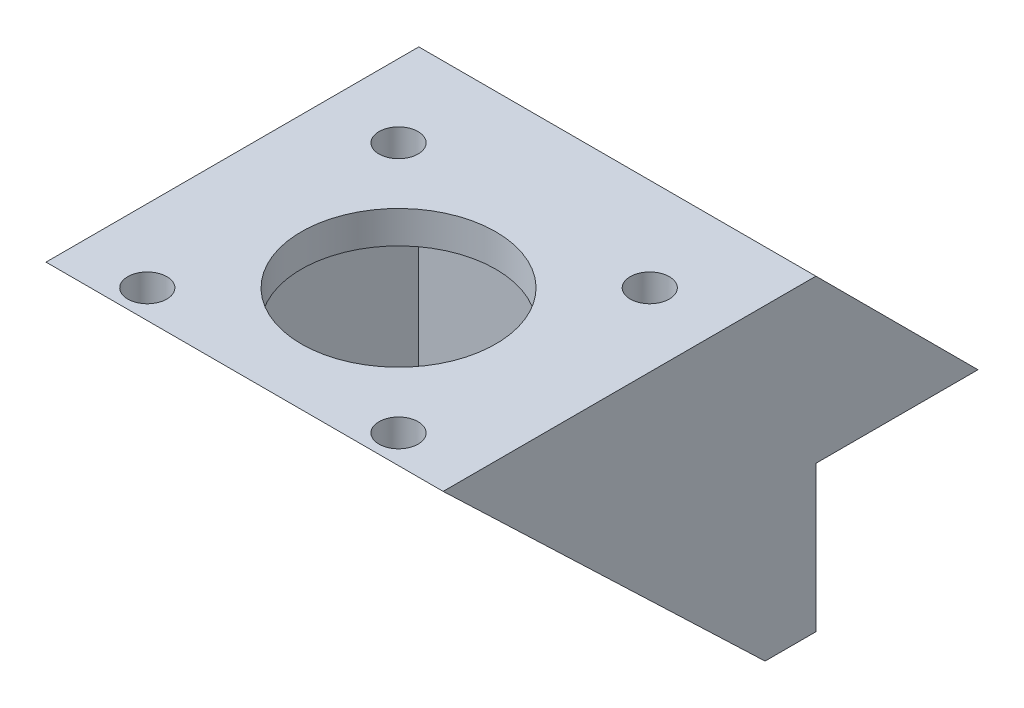
ISO-10303-21;
HEADER;
FILE_DESCRIPTION(('STEP AP214'),'2;1');
FILE_NAME('part.step','',(''),(''),'','','');
FILE_SCHEMA(('AUTOMOTIVE_DESIGN { 1 0 10303 214 1 1 1 1 }'));
ENDSEC;
DATA;
#1=APPLICATION_CONTEXT('core data for automotive mechanical design processes');
#2=APPLICATION_PROTOCOL_DEFINITION('international standard','automotive_design',2000,#1);
#3=PRODUCT_CONTEXT('',#1,'mechanical');
#4=PRODUCT('Part','Part','',(#3));
#5=PRODUCT_RELATED_PRODUCT_CATEGORY('part','',(#4));
#6=PRODUCT_DEFINITION_FORMATION('','',#4);
#7=PRODUCT_DEFINITION_CONTEXT('part definition',#1,'design');
#8=PRODUCT_DEFINITION('design','',#6,#7);
#9=PRODUCT_DEFINITION_SHAPE('','',#8);
#10=(LENGTH_UNIT() NAMED_UNIT(*) SI_UNIT(.MILLI.,.METRE.));
#11=(NAMED_UNIT(*) PLANE_ANGLE_UNIT() SI_UNIT($,.RADIAN.));
#12=(NAMED_UNIT(*) SI_UNIT($,.STERADIAN.) SOLID_ANGLE_UNIT());
#13=UNCERTAINTY_MEASURE_WITH_UNIT(LENGTH_MEASURE(1.E-05),#10,'distance_accuracy_value','');
#14=(GEOMETRIC_REPRESENTATION_CONTEXT(3) GLOBAL_UNCERTAINTY_ASSIGNED_CONTEXT((#13)) GLOBAL_UNIT_ASSIGNED_CONTEXT((#10,
#11,#12)) REPRESENTATION_CONTEXT('',''));
#15=CARTESIAN_POINT('',(0.,0.,0.));
#16=DIRECTION('',(0.,0.,1.));
#17=DIRECTION('',(1.,0.,0.));
#18=AXIS2_PLACEMENT_3D('',#15,#16,#17);
#19=CARTESIAN_POINT('',(10.5,-6.00000000000001,-23.));
#20=DIRECTION('',(0.,1.,0.));
#21=DIRECTION('',(0.,0.,1.));
#22=AXIS2_PLACEMENT_3D('',#19,#20,#21);
#23=CYLINDRICAL_SURFACE('',#22,4.25);
#24=CARTESIAN_POINT('',(10.5,24.,-23.));
#25=DIRECTION('',(0.,-1.,0.));
#26=DIRECTION('',(0.,0.,-1.));
#27=AXIS2_PLACEMENT_3D('',#24,#25,#26);
#28=CIRCLE('',#27,4.25);
#29=CARTESIAN_POINT('',(10.5,24.,-27.25));
#30=VERTEX_POINT('',#29);
#31=EDGE_CURVE('E216',#30,#30,#28,.T.);
#32=ORIENTED_EDGE('',*,*,#31,.T.);
#33=EDGE_LOOP('',(#32));
#34=FACE_BOUND('',#33,.T.);
#35=CARTESIAN_POINT('',(10.5,26.,-23.));
#36=DIRECTION('',(0.,1.,0.));
#37=DIRECTION('',(0.,0.,1.));
#38=AXIS2_PLACEMENT_3D('',#35,#36,#37);
#39=CIRCLE('',#38,4.25);
#40=CARTESIAN_POINT('',(10.5,26.,-18.75));
#41=VERTEX_POINT('',#40);
#42=EDGE_CURVE('E221',#41,#41,#39,.F.);
#43=ORIENTED_EDGE('',*,*,#42,.F.);
#44=EDGE_LOOP('',(#43));
#45=FACE_BOUND('',#44,.T.);
#46=ADVANCED_FACE('F54',(#34,#45),#23,.F.);
#47=CARTESIAN_POINT('',(-20.5110476695631,40.,-9.));
#48=DIRECTION('',(0.,-1.,0.));
#49=DIRECTION('',(0.,0.,-1.));
#50=AXIS2_PLACEMENT_3D('',#47,#48,#49);
#51=PLANE('',#50);
#52=CARTESIAN_POINT('',(0.,40.,14.));
#53=DIRECTION('',(0.,-1.,0.));
#54=DIRECTION('',(0.,0.,-1.));
#55=AXIS2_PLACEMENT_3D('',#52,#53,#54);
#56=CIRCLE('',#55,12.);
#57=CARTESIAN_POINT('',(0.,40.,1.99999999999999));
#58=VERTEX_POINT('',#57);
#59=EDGE_CURVE('E262',#58,#58,#56,.T.);
#60=ORIENTED_EDGE('',*,*,#59,.F.);
#61=EDGE_LOOP('',(#60));
#62=FACE_BOUND('',#61,.T.);
#63=CARTESIAN_POINT('',(15.5,40.,-1.50000000000001));
#64=DIRECTION('',(0.,-1.,0.));
#65=DIRECTION('',(0.,0.,-1.));
#66=AXIS2_PLACEMENT_3D('',#63,#64,#65);
#67=CIRCLE('',#66,2.40826824338042);
#68=CARTESIAN_POINT('',(15.5,40.,-3.90826824338043));
#69=VERTEX_POINT('',#68);
#70=EDGE_CURVE('E220',#69,#69,#67,.T.);
#71=ORIENTED_EDGE('',*,*,#70,.F.);
#72=EDGE_LOOP('',(#71));
#73=FACE_BOUND('',#72,.T.);
#74=CARTESIAN_POINT('',(-15.5,40.,-1.5));
#75=DIRECTION('',(0.,-1.,0.));
#76=DIRECTION('',(0.,0.,-1.));
#77=AXIS2_PLACEMENT_3D('',#74,#75,#76);
#78=CIRCLE('',#77,2.40826824338042);
#79=CARTESIAN_POINT('',(-15.5,40.,-3.90826824338042));
#80=VERTEX_POINT('',#79);
#81=EDGE_CURVE('E254',#80,#80,#78,.F.);
#82=ORIENTED_EDGE('',*,*,#81,.T.);
#83=EDGE_LOOP('',(#82));
#84=FACE_BOUND('',#83,.T.);
#85=DIRECTION('',(1.,0.,0.));
#86=VECTOR('',#85,1.);
#87=CARTESIAN_POINT('',(-20.5110476695631,40.,28.8181818181818));
#88=LINE('',#87,#86);
#89=CARTESIAN_POINT('',(17.8097358937802,40.,28.8181818181818));
#90=VERTEX_POINT('',#89);
#91=CARTESIAN_POINT('',(21.4889523304369,40.,28.8181818181818));
#92=VERTEX_POINT('',#91);
#93=EDGE_CURVE('E183',#90,#92,#88,.T.);
#94=ORIENTED_EDGE('',*,*,#93,.F.);
#95=CARTESIAN_POINT('',(15.5,40.,29.5));
#96=DIRECTION('',(0.,-1.,0.));
#97=DIRECTION('',(0.,0.,-1.));
#98=AXIS2_PLACEMENT_3D('',#95,#96,#97);
#99=CIRCLE('',#98,2.40826824338042);
#100=CARTESIAN_POINT('',(13.1902641062198,40.,28.8181818181818));
#101=VERTEX_POINT('',#100);
#102=EDGE_CURVE('E78',#90,#101,#99,.F.);
#103=ORIENTED_EDGE('',*,*,#102,.T.);
#104=CARTESIAN_POINT('',(-13.1902641062198,40.,28.8181818181818));
#105=VERTEX_POINT('',#104);
#106=EDGE_CURVE('E187',#105,#101,#88,.T.);
#107=ORIENTED_EDGE('',*,*,#106,.F.);
#108=CARTESIAN_POINT('',(-15.5,40.,29.5));
#109=DIRECTION('',(0.,-1.,0.));
#110=DIRECTION('',(0.,0.,-1.));
#111=AXIS2_PLACEMENT_3D('',#108,#109,#110);
#112=CIRCLE('',#111,2.40826824338042);
#113=CARTESIAN_POINT('',(-17.8097358937802,40.,28.8181818181818));
#114=VERTEX_POINT('',#113);
#115=EDGE_CURVE('E260',#114,#105,#112,.T.);
#116=ORIENTED_EDGE('',*,*,#115,.F.);
#117=CARTESIAN_POINT('',(-20.5110476695631,40.,28.8181818181818));
#118=VERTEX_POINT('',#117);
#119=EDGE_CURVE('E184',#118,#114,#88,.T.);
#120=ORIENTED_EDGE('',*,*,#119,.F.);
#121=DIRECTION('',(0.,0.,1.));
#122=VECTOR('',#121,1.);
#123=CARTESIAN_POINT('',(-20.5110476695631,40.,-9.));
#124=LINE('',#123,#122);
#125=CARTESIAN_POINT('',(-20.5110476695631,40.,-9.));
#126=VERTEX_POINT('',#125);
#127=EDGE_CURVE('E199',#126,#118,#124,.T.);
#128=ORIENTED_EDGE('',*,*,#127,.F.);
#129=DIRECTION('',(1.,0.,0.));
#130=VECTOR('',#129,1.);
#131=CARTESIAN_POINT('',(-20.5110476695631,40.,-9.));
#132=LINE('',#131,#130);
#133=CARTESIAN_POINT('',(21.4889523304369,40.,-9.));
#134=VERTEX_POINT('',#133);
#135=EDGE_CURVE('E192',#126,#134,#132,.T.);
#136=ORIENTED_EDGE('',*,*,#135,.T.);
#137=DIRECTION('',(0.,0.,1.));
#138=VECTOR('',#137,1.);
#139=CARTESIAN_POINT('',(21.4889523304369,40.,-9.));
#140=LINE('',#139,#138);
#141=EDGE_CURVE('E202',#134,#92,#140,.T.);
#142=ORIENTED_EDGE('',*,*,#141,.T.);
#143=EDGE_LOOP('',(#94,#103,#107,#116,#120,#128,#136,#142));
#144=FACE_BOUND('',#143,.T.);
#145=ADVANCED_FACE('F313',(#62,#73,#84,#144),#51,.T.);
#146=CARTESIAN_POINT('',(25.5,6.49358341559724,-6.21125370187562));
#147=DIRECTION('',(0.,0.722641857147699,-0.691222645967364));
#148=DIRECTION('',(0.,0.691222645967364,0.722641857147699));
#149=AXIS2_PLACEMENT_3D('',#146,#147,#148);
#150=PLANE('',#149);
#151=DIRECTION('',(0.,-0.691222645967364,-0.722641857147699));
#152=VECTOR('',#151,1.);
#153=CARTESIAN_POINT('',(-24.5,6.49358341559724,-6.21125370187562));
#154=LINE('',#153,#152);
#155=CARTESIAN_POINT('',(-24.5,44.,33.));
#156=VERTEX_POINT('',#155);
#157=CARTESIAN_POINT('',(-24.5,6.,-6.72727272727273));
#158=VERTEX_POINT('',#157);
#159=EDGE_CURVE('E165',#156,#158,#154,.T.);
#160=ORIENTED_EDGE('',*,*,#159,.T.);
#161=DIRECTION('',(1.,0.,0.));
#162=VECTOR('',#161,1.);
#163=CARTESIAN_POINT('',(25.5,6.,-6.72727272727273));
#164=LINE('',#163,#162);
#165=CARTESIAN_POINT('',(-20.5110476695631,6.,-6.72727272727273));
#166=VERTEX_POINT('',#165);
#167=EDGE_CURVE('E296',#158,#166,#164,.T.);
#168=ORIENTED_EDGE('',*,*,#167,.T.);
#169=DIRECTION('',(0.,0.691222645967364,0.722641857147699));
#170=VECTOR('',#169,1.);
#171=CARTESIAN_POINT('',(-20.5110476695631,1.99802566633761,-10.9111549851925));
#172=LINE('',#171,#170);
#173=EDGE_CURVE('E179',#166,#118,#172,.T.);
#174=ORIENTED_EDGE('',*,*,#173,.T.);
#175=ORIENTED_EDGE('',*,*,#119,.T.);
#176=CARTESIAN_POINT('',(-15.5,40.6521739130435,29.5));
#177=DIRECTION('',(0.,0.722641857147699,-0.691222645967364));
#178=DIRECTION('',(0.,0.691222645967364,0.722641857147699));
#179=AXIS2_PLACEMENT_3D('',#176,#177,#178);
#180=ELLIPSE('',#179,3.33258891601708,2.40826824338042);
#181=EDGE_CURVE('E257',#114,#105,#180,.T.);
#182=ORIENTED_EDGE('',*,*,#181,.T.);
#183=ORIENTED_EDGE('',*,*,#106,.T.);
#184=CARTESIAN_POINT('',(15.5,40.6521739130435,29.5));
#185=DIRECTION('',(0.,0.722641857147699,-0.691222645967364));
#186=DIRECTION('',(0.,0.691222645967364,0.722641857147699));
#187=AXIS2_PLACEMENT_3D('',#184,#185,#186);
#188=ELLIPSE('',#187,3.33258891601708,2.40826824338042);
#189=EDGE_CURVE('E265',#90,#101,#188,.F.);
#190=ORIENTED_EDGE('',*,*,#189,.F.);
#191=ORIENTED_EDGE('',*,*,#93,.T.);
#192=DIRECTION('',(0.,0.691222645967364,0.722641857147699));
#193=VECTOR('',#192,1.);
#194=CARTESIAN_POINT('',(21.4889523304369,1.99802566633761,-10.9111549851925));
#195=LINE('',#194,#193);
#196=CARTESIAN_POINT('',(21.4889523304369,6.,-6.72727272727273));
#197=VERTEX_POINT('',#196);
#198=EDGE_CURVE('E181',#197,#92,#195,.T.);
#199=ORIENTED_EDGE('',*,*,#198,.F.);
#200=CARTESIAN_POINT('',(24.5,6.,-6.72727272727273));
#201=VERTEX_POINT('',#200);
#202=EDGE_CURVE('E293',#197,#201,#164,.T.);
#203=ORIENTED_EDGE('',*,*,#202,.T.);
#204=DIRECTION('',(0.,-0.691222645967364,-0.722641857147699));
#205=VECTOR('',#204,1.);
#206=CARTESIAN_POINT('',(24.5,44.,33.));
#207=LINE('',#206,#205);
#208=CARTESIAN_POINT('',(24.5,44.,33.));
#209=VERTEX_POINT('',#208);
#210=EDGE_CURVE('E159',#209,#201,#207,.T.);
#211=ORIENTED_EDGE('',*,*,#210,.F.);
#212=DIRECTION('',(1.,0.,0.));
#213=VECTOR('',#212,1.);
#214=CARTESIAN_POINT('',(24.5,44.,33.));
#215=LINE('',#214,#213);
#216=EDGE_CURVE('E208',#156,#209,#215,.T.);
#217=ORIENTED_EDGE('',*,*,#216,.F.);
#218=EDGE_LOOP('',(#160,#168,#174,#175,#182,#183,#190,#191,#199,#203,#211,#217));
#219=FACE_BOUND('',#218,.T.);
#220=ADVANCED_FACE('F285',(#219),#150,.F.);
#221=CARTESIAN_POINT('',(0.,44.,0.));
#222=DIRECTION('',(0.,1.,0.));
#223=DIRECTION('',(0.,0.,1.));
#224=AXIS2_PLACEMENT_3D('',#221,#222,#223);
#225=PLANE('',#224);
#226=CARTESIAN_POINT('',(-15.5,44.,-1.5));
#227=DIRECTION('',(0.,-1.,0.));
#228=DIRECTION('',(0.,0.,-1.));
#229=AXIS2_PLACEMENT_3D('',#226,#227,#228);
#230=CIRCLE('',#229,2.40826824338042);
#231=CARTESIAN_POINT('',(-15.5,44.,-3.90826824338042));
#232=VERTEX_POINT('',#231);
#233=EDGE_CURVE('E232',#232,#232,#230,.T.);
#234=ORIENTED_EDGE('',*,*,#233,.T.);
#235=EDGE_LOOP('',(#234));
#236=FACE_BOUND('',#235,.T.);
#237=CARTESIAN_POINT('',(15.5,44.,-1.50000000000001));
#238=DIRECTION('',(0.,1.,0.));
#239=DIRECTION('',(0.,0.,1.));
#240=AXIS2_PLACEMENT_3D('',#237,#238,#239);
#241=CIRCLE('',#240,2.40826824338042);
#242=CARTESIAN_POINT('',(15.5,44.,0.908268243380413));
#243=VERTEX_POINT('',#242);
#244=EDGE_CURVE('E217',#243,#243,#241,.T.);
#245=ORIENTED_EDGE('',*,*,#244,.F.);
#246=EDGE_LOOP('',(#245));
#247=FACE_BOUND('',#246,.T.);
#248=DIRECTION('',(0.,0.,-1.));
#249=VECTOR('',#248,1.);
#250=CARTESIAN_POINT('',(24.5,44.,33.));
#251=LINE('',#250,#249);
#252=CARTESIAN_POINT('',(24.5,44.,-13.));
#253=VERTEX_POINT('',#252);
#254=EDGE_CURVE('E63',#209,#253,#251,.T.);
#255=ORIENTED_EDGE('',*,*,#254,.T.);
#256=DIRECTION('',(-1.,0.,0.));
#257=VECTOR('',#256,1.);
#258=CARTESIAN_POINT('',(0.,44.,-13.));
#259=LINE('',#258,#257);
#260=CARTESIAN_POINT('',(-24.5,44.,-13.));
#261=VERTEX_POINT('',#260);
#262=EDGE_CURVE('E12',#253,#261,#259,.T.);
#263=ORIENTED_EDGE('',*,*,#262,.T.);
#264=DIRECTION('',(0.,0.,1.));
#265=VECTOR('',#264,1.);
#266=CARTESIAN_POINT('',(-24.5,44.,33.));
#267=LINE('',#266,#265);
#268=EDGE_CURVE('E205',#261,#156,#267,.T.);
#269=ORIENTED_EDGE('',*,*,#268,.T.);
#270=ORIENTED_EDGE('',*,*,#216,.T.);
#271=EDGE_LOOP('',(#255,#263,#269,#270));
#272=FACE_BOUND('',#271,.T.);
#273=CARTESIAN_POINT('',(-15.5,44.,29.5));
#274=DIRECTION('',(0.,1.,0.));
#275=DIRECTION('',(0.,0.,1.));
#276=AXIS2_PLACEMENT_3D('',#273,#274,#275);
#277=CIRCLE('',#276,2.40826824338042);
#278=CARTESIAN_POINT('',(-15.5,44.,31.9082682433804));
#279=VERTEX_POINT('',#278);
#280=EDGE_CURVE('E236',#279,#279,#277,.T.);
#281=ORIENTED_EDGE('',*,*,#280,.F.);
#282=EDGE_LOOP('',(#281));
#283=FACE_BOUND('',#282,.T.);
#284=CARTESIAN_POINT('',(0.,44.,14.));
#285=DIRECTION('',(0.,1.,0.));
#286=DIRECTION('',(0.,0.,1.));
#287=AXIS2_PLACEMENT_3D('',#284,#285,#286);
#288=CIRCLE('',#287,12.);
#289=CARTESIAN_POINT('',(0.,44.,26.));
#290=VERTEX_POINT('',#289);
#291=EDGE_CURVE('E247',#290,#290,#288,.T.);
#292=ORIENTED_EDGE('',*,*,#291,.F.);
#293=EDGE_LOOP('',(#292));
#294=FACE_BOUND('',#293,.T.);
#295=CARTESIAN_POINT('',(15.5,44.,29.5));
#296=DIRECTION('',(0.,-1.,0.));
#297=DIRECTION('',(0.,0.,-1.));
#298=AXIS2_PLACEMENT_3D('',#295,#296,#297);
#299=CIRCLE('',#298,2.40826824338042);
#300=CARTESIAN_POINT('',(15.5,44.,27.0917317566196));
#301=VERTEX_POINT('',#300);
#302=EDGE_CURVE('E241',#301,#301,#299,.T.);
#303=ORIENTED_EDGE('',*,*,#302,.T.);
#304=EDGE_LOOP('',(#303));
#305=FACE_BOUND('',#304,.T.);
#306=ADVANCED_FACE('F282',(#236,#247,#272,#283,#294,#305),#225,.T.);
#307=CARTESIAN_POINT('',(25.5,28.5,-28.5));
#308=DIRECTION('',(0.,0.707106781186548,-0.707106781186548));
#309=DIRECTION('',(0.,0.707106781186548,0.707106781186548));
#310=AXIS2_PLACEMENT_3D('',#307,#308,#309);
#311=PLANE('',#310);
#312=CARTESIAN_POINT('',(10.5,34.,-23.));
#313=DIRECTION('',(0.,0.707106781186548,-0.707106781186548));
#314=DIRECTION('',(0.,0.707106781186548,0.707106781186548));
#315=AXIS2_PLACEMENT_3D('',#312,#313,#314);
#316=ELLIPSE('',#315,7.07106781186548,5.);
#317=CARTESIAN_POINT('',(10.5,39.,-18.));
#318=VERTEX_POINT('',#317);
#319=EDGE_CURVE('E58',#318,#318,#316,.T.);
#320=ORIENTED_EDGE('',*,*,#319,.F.);
#321=EDGE_LOOP('',(#320));
#322=FACE_BOUND('',#321,.T.);
#323=CARTESIAN_POINT('',(-10.5,34.,-23.));
#324=DIRECTION('',(0.,0.707106781186548,-0.707106781186548));
#325=DIRECTION('',(0.,0.707106781186548,0.707106781186548));
#326=AXIS2_PLACEMENT_3D('',#323,#324,#325);
#327=ELLIPSE('',#326,7.07106781186548,5.);
#328=CARTESIAN_POINT('',(-10.5,39.,-18.));
#329=VERTEX_POINT('',#328);
#330=EDGE_CURVE('E227',#329,#329,#327,.T.);
#331=ORIENTED_EDGE('',*,*,#330,.F.);
#332=EDGE_LOOP('',(#331));
#333=FACE_BOUND('',#332,.T.);
#334=DIRECTION('',(0.,-0.707106781186548,-0.707106781186548));
#335=VECTOR('',#334,1.);
#336=CARTESIAN_POINT('',(24.5,67.,10.));
#337=LINE('',#336,#335);
#338=CARTESIAN_POINT('',(24.5,24.,-33.));
#339=VERTEX_POINT('',#338);
#340=EDGE_CURVE('E189',#253,#339,#337,.T.);
#341=ORIENTED_EDGE('',*,*,#340,.T.);
#342=DIRECTION('',(-1.,0.,0.));
#343=VECTOR('',#342,1.);
#344=CARTESIAN_POINT('',(25.5,24.,-33.));
#345=LINE('',#344,#343);
#346=CARTESIAN_POINT('',(-24.5,24.,-33.));
#347=VERTEX_POINT('',#346);
#348=EDGE_CURVE('E176',#339,#347,#345,.T.);
#349=ORIENTED_EDGE('',*,*,#348,.T.);
#350=DIRECTION('',(0.,-0.707106781186548,-0.707106781186548));
#351=VECTOR('',#350,1.);
#352=CARTESIAN_POINT('',(-24.5,28.5,-28.5));
#353=LINE('',#352,#351);
#354=EDGE_CURVE('E169',#261,#347,#353,.T.);
#355=ORIENTED_EDGE('',*,*,#354,.F.);
#356=ORIENTED_EDGE('',*,*,#262,.F.);
#357=EDGE_LOOP('',(#341,#349,#355,#356));
#358=FACE_BOUND('',#357,.T.);
#359=ADVANCED_FACE('F279',(#322,#333,#358),#311,.T.);
#360=CARTESIAN_POINT('',(25.5,24.,0.));
#361=DIRECTION('',(0.,-1.,0.));
#362=DIRECTION('',(0.,0.,-1.));
#363=AXIS2_PLACEMENT_3D('',#360,#361,#362);
#364=PLANE('',#363);
#365=CARTESIAN_POINT('',(-10.5,24.,-23.));
#366=DIRECTION('',(0.,-1.,0.));
#367=DIRECTION('',(0.,0.,-1.));
#368=AXIS2_PLACEMENT_3D('',#365,#366,#367);
#369=CIRCLE('',#368,4.25);
#370=CARTESIAN_POINT('',(-10.5,24.,-27.25));
#371=VERTEX_POINT('',#370);
#372=EDGE_CURVE('E213',#371,#371,#369,.F.);
#373=ORIENTED_EDGE('',*,*,#372,.T.);
#374=EDGE_LOOP('',(#373));
#375=FACE_BOUND('',#374,.T.);
#376=DIRECTION('',(0.,0.,1.));
#377=VECTOR('',#376,1.);
#378=CARTESIAN_POINT('',(24.5,24.,33.));
#379=LINE('',#378,#377);
#380=CARTESIAN_POINT('',(24.5,24.,-13.));
#381=VERTEX_POINT('',#380);
#382=EDGE_CURVE('E166',#339,#381,#379,.T.);
#383=ORIENTED_EDGE('',*,*,#382,.T.);
#384=DIRECTION('',(-1.,0.,0.));
#385=VECTOR('',#384,1.);
#386=CARTESIAN_POINT('',(25.5,24.,-13.));
#387=LINE('',#386,#385);
#388=CARTESIAN_POINT('',(-24.5,24.,-13.));
#389=VERTEX_POINT('',#388);
#390=EDGE_CURVE('E164',#381,#389,#387,.T.);
#391=ORIENTED_EDGE('',*,*,#390,.T.);
#392=DIRECTION('',(0.,0.,1.));
#393=VECTOR('',#392,1.);
#394=CARTESIAN_POINT('',(-24.5,24.,0.));
#395=LINE('',#394,#393);
#396=EDGE_CURVE('E268',#347,#389,#395,.T.);
#397=ORIENTED_EDGE('',*,*,#396,.F.);
#398=ORIENTED_EDGE('',*,*,#348,.F.);
#399=EDGE_LOOP('',(#383,#391,#397,#398));
#400=FACE_BOUND('',#399,.T.);
#401=ORIENTED_EDGE('',*,*,#31,.F.);
#402=EDGE_LOOP('',(#401));
#403=FACE_BOUND('',#402,.T.);
#404=ADVANCED_FACE('F273',(#375,#400,#403),#364,.T.);
#405=CARTESIAN_POINT('',(-24.5,44.,33.));
#406=DIRECTION('',(1.,0.,0.));
#407=DIRECTION('',(0.,0.,-1.));
#408=AXIS2_PLACEMENT_3D('',#405,#406,#407);
#409=PLANE('',#408);
#410=DIRECTION('',(0.,-1.,0.));
#411=VECTOR('',#410,1.);
#412=CARTESIAN_POINT('',(-24.5,0.,-13.));
#413=LINE('',#412,#411);
#414=CARTESIAN_POINT('',(-24.5,6.,-13.));
#415=VERTEX_POINT('',#414);
#416=EDGE_CURVE('E271',#389,#415,#413,.T.);
#417=ORIENTED_EDGE('',*,*,#416,.T.);
#418=DIRECTION('',(0.,0.,-1.));
#419=VECTOR('',#418,1.);
#420=CARTESIAN_POINT('',(-24.5,6.,5.));
#421=LINE('',#420,#419);
#422=EDGE_CURVE('E71',#158,#415,#421,.T.);
#423=ORIENTED_EDGE('',*,*,#422,.F.);
#424=ORIENTED_EDGE('',*,*,#159,.F.);
#425=ORIENTED_EDGE('',*,*,#268,.F.);
#426=ORIENTED_EDGE('',*,*,#354,.T.);
#427=ORIENTED_EDGE('',*,*,#396,.T.);
#428=EDGE_LOOP('',(#417,#423,#424,#425,#426,#427));
#429=FACE_BOUND('',#428,.T.);
#430=ADVANCED_FACE('F56',(#429),#409,.F.);
#431=CARTESIAN_POINT('',(24.5,44.,33.));
#432=DIRECTION('',(-1.,0.,0.));
#433=DIRECTION('',(0.,0.,1.));
#434=AXIS2_PLACEMENT_3D('',#431,#432,#433);
#435=PLANE('',#434);
#436=ORIENTED_EDGE('',*,*,#210,.T.);
#437=DIRECTION('',(0.,0.,-1.));
#438=VECTOR('',#437,1.);
#439=CARTESIAN_POINT('',(24.5,6.,5.));
#440=LINE('',#439,#438);
#441=CARTESIAN_POINT('',(24.5,6.,-13.));
#442=VERTEX_POINT('',#441);
#443=EDGE_CURVE('E145',#201,#442,#440,.T.);
#444=ORIENTED_EDGE('',*,*,#443,.T.);
#445=DIRECTION('',(0.,-1.,0.));
#446=VECTOR('',#445,1.);
#447=CARTESIAN_POINT('',(24.5,44.,-13.));
#448=LINE('',#447,#446);
#449=EDGE_CURVE('E157',#381,#442,#448,.T.);
#450=ORIENTED_EDGE('',*,*,#449,.F.);
#451=ORIENTED_EDGE('',*,*,#382,.F.);
#452=ORIENTED_EDGE('',*,*,#340,.F.);
#453=ORIENTED_EDGE('',*,*,#254,.F.);
#454=EDGE_LOOP('',(#436,#444,#450,#451,#452,#453));
#455=FACE_BOUND('',#454,.T.);
#456=ADVANCED_FACE('F155',(#455),#435,.F.);
#457=CARTESIAN_POINT('',(0.,0.,-9.));
#458=DIRECTION('',(0.,0.,1.));
#459=DIRECTION('',(1.,0.,0.));
#460=AXIS2_PLACEMENT_3D('',#457,#458,#459);
#461=PLANE('',#460);
#462=DIRECTION('',(-1.,0.,0.));
#463=VECTOR('',#462,1.);
#464=CARTESIAN_POINT('',(0.,6.,-9.));
#465=LINE('',#464,#463);
#466=CARTESIAN_POINT('',(21.4889523304369,6.,-9.));
#467=VERTEX_POINT('',#466);
#468=CARTESIAN_POINT('',(-20.5110476695631,6.,-9.));
#469=VERTEX_POINT('',#468);
#470=EDGE_CURVE('E291',#467,#469,#465,.T.);
#471=ORIENTED_EDGE('',*,*,#470,.F.);
#472=DIRECTION('',(0.,1.,0.));
#473=VECTOR('',#472,1.);
#474=CARTESIAN_POINT('',(21.4889523304369,0.,-9.));
#475=LINE('',#474,#473);
#476=EDGE_CURVE('E195',#467,#134,#475,.T.);
#477=ORIENTED_EDGE('',*,*,#476,.T.);
#478=ORIENTED_EDGE('',*,*,#135,.F.);
#479=DIRECTION('',(0.,1.,0.));
#480=VECTOR('',#479,1.);
#481=CARTESIAN_POINT('',(-20.5110476695631,0.,-9.));
#482=LINE('',#481,#480);
#483=EDGE_CURVE('E197',#469,#126,#482,.T.);
#484=ORIENTED_EDGE('',*,*,#483,.F.);
#485=EDGE_LOOP('',(#471,#477,#478,#484));
#486=FACE_BOUND('',#485,.T.);
#487=ADVANCED_FACE('F318',(#486),#461,.T.);
#488=CARTESIAN_POINT('',(-20.5110476695631,0.,-9.));
#489=DIRECTION('',(1.,0.,0.));
#490=DIRECTION('',(0.,0.,-1.));
#491=AXIS2_PLACEMENT_3D('',#488,#489,#490);
#492=PLANE('',#491);
#493=DIRECTION('',(0.,0.,1.));
#494=VECTOR('',#493,1.);
#495=CARTESIAN_POINT('',(-20.5110476695631,6.,-9.));
#496=LINE('',#495,#494);
#497=EDGE_CURVE('E295',#469,#166,#496,.T.);
#498=ORIENTED_EDGE('',*,*,#497,.F.);
#499=ORIENTED_EDGE('',*,*,#483,.T.);
#500=ORIENTED_EDGE('',*,*,#127,.T.);
#501=ORIENTED_EDGE('',*,*,#173,.F.);
#502=EDGE_LOOP('',(#498,#499,#500,#501));
#503=FACE_BOUND('',#502,.T.);
#504=ADVANCED_FACE('F307',(#503),#492,.T.);
#505=CARTESIAN_POINT('',(21.4889523304369,0.,-9.));
#506=DIRECTION('',(1.,0.,0.));
#507=DIRECTION('',(0.,0.,-1.));
#508=AXIS2_PLACEMENT_3D('',#505,#506,#507);
#509=PLANE('',#508);
#510=ORIENTED_EDGE('',*,*,#476,.F.);
#511=DIRECTION('',(0.,0.,1.));
#512=VECTOR('',#511,1.);
#513=CARTESIAN_POINT('',(21.4889523304369,6.,-9.));
#514=LINE('',#513,#512);
#515=EDGE_CURVE('E160',#467,#197,#514,.T.);
#516=ORIENTED_EDGE('',*,*,#515,.T.);
#517=ORIENTED_EDGE('',*,*,#198,.T.);
#518=ORIENTED_EDGE('',*,*,#141,.F.);
#519=EDGE_LOOP('',(#510,#516,#517,#518));
#520=FACE_BOUND('',#519,.T.);
#521=ADVANCED_FACE('F321',(#520),#509,.F.);
#522=CARTESIAN_POINT('',(25.5,0.,-13.));
#523=DIRECTION('',(0.,0.,-1.));
#524=DIRECTION('',(0.,1.,0.));
#525=AXIS2_PLACEMENT_3D('',#522,#523,#524);
#526=PLANE('',#525);
#527=DIRECTION('',(1.,0.,0.));
#528=VECTOR('',#527,1.);
#529=CARTESIAN_POINT('',(24.5,6.,-13.));
#530=LINE('',#529,#528);
#531=EDGE_CURVE('E142',#415,#442,#530,.T.);
#532=ORIENTED_EDGE('',*,*,#531,.F.);
#533=ORIENTED_EDGE('',*,*,#416,.F.);
#534=ORIENTED_EDGE('',*,*,#390,.F.);
#535=ORIENTED_EDGE('',*,*,#449,.T.);
#536=EDGE_LOOP('',(#532,#533,#534,#535));
#537=FACE_BOUND('',#536,.T.);
#538=ADVANCED_FACE('F163',(#537),#526,.T.);
#539=CARTESIAN_POINT('',(-10.5,-6.00000000000001,-23.));
#540=DIRECTION('',(0.,1.,0.));
#541=DIRECTION('',(0.,0.,1.));
#542=AXIS2_PLACEMENT_3D('',#539,#540,#541);
#543=CYLINDRICAL_SURFACE('',#542,4.25);
#544=CARTESIAN_POINT('',(-10.5,26.,-23.));
#545=DIRECTION('',(0.,-1.,0.));
#546=DIRECTION('',(0.,0.,-1.));
#547=AXIS2_PLACEMENT_3D('',#544,#545,#546);
#548=CIRCLE('',#547,4.25);
#549=CARTESIAN_POINT('',(-10.5,26.,-27.25));
#550=VERTEX_POINT('',#549);
#551=EDGE_CURVE('E224',#550,#550,#548,.T.);
#552=ORIENTED_EDGE('',*,*,#551,.F.);
#553=EDGE_LOOP('',(#552));
#554=FACE_BOUND('',#553,.T.);
#555=ORIENTED_EDGE('',*,*,#372,.F.);
#556=EDGE_LOOP('',(#555));
#557=FACE_BOUND('',#556,.T.);
#558=ADVANCED_FACE('F404',(#554,#557),#543,.F.);
#559=CARTESIAN_POINT('',(15.5,-6.00000000000001,-1.50000000000001));
#560=DIRECTION('',(0.,1.,0.));
#561=DIRECTION('',(0.,0.,1.));
#562=AXIS2_PLACEMENT_3D('',#559,#560,#561);
#563=CYLINDRICAL_SURFACE('',#562,2.40826824338042);
#564=ORIENTED_EDGE('',*,*,#70,.T.);
#565=EDGE_LOOP('',(#564));
#566=FACE_BOUND('',#565,.T.);
#567=ORIENTED_EDGE('',*,*,#244,.T.);
#568=EDGE_LOOP('',(#567));
#569=FACE_BOUND('',#568,.T.);
#570=ADVANCED_FACE('F365',(#566,#569),#563,.F.);
#571=CARTESIAN_POINT('',(-15.5,-6.00000000000001,-1.5));
#572=DIRECTION('',(0.,1.,0.));
#573=DIRECTION('',(0.,0.,1.));
#574=AXIS2_PLACEMENT_3D('',#571,#572,#573);
#575=CYLINDRICAL_SURFACE('',#574,2.40826824338042);
#576=ORIENTED_EDGE('',*,*,#81,.F.);
#577=EDGE_LOOP('',(#576));
#578=FACE_BOUND('',#577,.T.);
#579=ORIENTED_EDGE('',*,*,#233,.F.);
#580=EDGE_LOOP('',(#579));
#581=FACE_BOUND('',#580,.T.);
#582=ADVANCED_FACE('F331',(#578,#581),#575,.F.);
#583=CARTESIAN_POINT('',(-15.5,-6.00000000000001,29.5));
#584=DIRECTION('',(0.,1.,0.));
#585=DIRECTION('',(0.,0.,1.));
#586=AXIS2_PLACEMENT_3D('',#583,#584,#585);
#587=CYLINDRICAL_SURFACE('',#586,2.40826824338042);
#588=ORIENTED_EDGE('',*,*,#115,.T.);
#589=ORIENTED_EDGE('',*,*,#181,.F.);
#590=EDGE_LOOP('',(#588,#589));
#591=FACE_BOUND('',#590,.T.);
#592=ORIENTED_EDGE('',*,*,#280,.T.);
#593=EDGE_LOOP('',(#592));
#594=FACE_BOUND('',#593,.T.);
#595=ADVANCED_FACE('F327',(#591,#594),#587,.F.);
#596=CARTESIAN_POINT('',(0.,-6.00000000000001,14.));
#597=DIRECTION('',(0.,1.,0.));
#598=DIRECTION('',(0.,0.,1.));
#599=AXIS2_PLACEMENT_3D('',#596,#597,#598);
#600=CYLINDRICAL_SURFACE('',#599,12.);
#601=ORIENTED_EDGE('',*,*,#59,.T.);
#602=EDGE_LOOP('',(#601));
#603=FACE_BOUND('',#602,.T.);
#604=ORIENTED_EDGE('',*,*,#291,.T.);
#605=EDGE_LOOP('',(#604));
#606=FACE_BOUND('',#605,.T.);
#607=ADVANCED_FACE('F330',(#603,#606),#600,.F.);
#608=CARTESIAN_POINT('',(15.5,-6.00000000000001,29.5));
#609=DIRECTION('',(0.,1.,0.));
#610=DIRECTION('',(0.,0.,1.));
#611=AXIS2_PLACEMENT_3D('',#608,#609,#610);
#612=CYLINDRICAL_SURFACE('',#611,2.40826824338042);
#613=ORIENTED_EDGE('',*,*,#189,.T.);
#614=ORIENTED_EDGE('',*,*,#102,.F.);
#615=EDGE_LOOP('',(#613,#614));
#616=FACE_BOUND('',#615,.T.);
#617=ORIENTED_EDGE('',*,*,#302,.F.);
#618=EDGE_LOOP('',(#617));
#619=FACE_BOUND('',#618,.T.);
#620=ADVANCED_FACE('F341',(#616,#619),#612,.F.);
#621=CARTESIAN_POINT('',(10.5,26.,-23.));
#622=DIRECTION('',(0.,1.,0.));
#623=DIRECTION('',(0.,0.,1.));
#624=AXIS2_PLACEMENT_3D('',#621,#622,#623);
#625=PLANE('',#624);
#626=CARTESIAN_POINT('',(10.5,26.,-23.));
#627=DIRECTION('',(0.,1.,0.));
#628=DIRECTION('',(0.,0.,1.));
#629=AXIS2_PLACEMENT_3D('',#626,#627,#628);
#630=CIRCLE('',#629,5.);
#631=CARTESIAN_POINT('',(10.5,26.,-18.));
#632=VERTEX_POINT('',#631);
#633=EDGE_CURVE('E225',#632,#632,#630,.T.);
#634=ORIENTED_EDGE('',*,*,#633,.T.);
#635=EDGE_LOOP('',(#634));
#636=FACE_BOUND('',#635,.T.);
#637=ORIENTED_EDGE('',*,*,#42,.T.);
#638=EDGE_LOOP('',(#637));
#639=FACE_BOUND('',#638,.T.);
#640=ADVANCED_FACE('F343',(#636,#639),#625,.T.);
#641=CARTESIAN_POINT('',(10.5,26.,-23.));
#642=DIRECTION('',(0.,1.,0.));
#643=DIRECTION('',(0.,0.,1.));
#644=AXIS2_PLACEMENT_3D('',#641,#642,#643);
#645=CYLINDRICAL_SURFACE('',#644,5.);
#646=ORIENTED_EDGE('',*,*,#319,.T.);
#647=EDGE_LOOP('',(#646));
#648=FACE_BOUND('',#647,.T.);
#649=ORIENTED_EDGE('',*,*,#633,.F.);
#650=EDGE_LOOP('',(#649));
#651=FACE_BOUND('',#650,.T.);
#652=ADVANCED_FACE('F349',(#648,#651),#645,.F.);
#653=CARTESIAN_POINT('',(-10.5,26.,-23.));
#654=DIRECTION('',(0.,1.,0.));
#655=DIRECTION('',(0.,0.,1.));
#656=AXIS2_PLACEMENT_3D('',#653,#654,#655);
#657=CYLINDRICAL_SURFACE('',#656,5.);
#658=ORIENTED_EDGE('',*,*,#330,.T.);
#659=EDGE_LOOP('',(#658));
#660=FACE_BOUND('',#659,.T.);
#661=CARTESIAN_POINT('',(-10.5,26.,-23.));
#662=DIRECTION('',(0.,1.,0.));
#663=DIRECTION('',(0.,0.,-1.));
#664=AXIS2_PLACEMENT_3D('',#661,#662,#663);
#665=CIRCLE('',#664,5.);
#666=CARTESIAN_POINT('',(-10.5,26.,-28.));
#667=VERTEX_POINT('',#666);
#668=EDGE_CURVE('E299',#667,#667,#665,.T.);
#669=ORIENTED_EDGE('',*,*,#668,.F.);
#670=EDGE_LOOP('',(#669));
#671=FACE_BOUND('',#670,.T.);
#672=ADVANCED_FACE('F368',(#660,#671),#657,.F.);
#673=CARTESIAN_POINT('',(-10.5,26.,-23.));
#674=DIRECTION('',(0.,-1.,0.));
#675=DIRECTION('',(0.,0.,-1.));
#676=AXIS2_PLACEMENT_3D('',#673,#674,#675);
#677=PLANE('',#676);
#678=ORIENTED_EDGE('',*,*,#551,.T.);
#679=EDGE_LOOP('',(#678));
#680=FACE_BOUND('',#679,.T.);
#681=ORIENTED_EDGE('',*,*,#668,.T.);
#682=EDGE_LOOP('',(#681));
#683=FACE_BOUND('',#682,.T.);
#684=ADVANCED_FACE('F371',(#680,#683),#677,.F.);
#685=CARTESIAN_POINT('',(24.5,6.,5.));
#686=DIRECTION('',(0.,1.,0.));
#687=DIRECTION('',(0.,0.,1.));
#688=AXIS2_PLACEMENT_3D('',#685,#686,#687);
#689=PLANE('',#688);
#690=ORIENTED_EDGE('',*,*,#422,.T.);
#691=ORIENTED_EDGE('',*,*,#531,.T.);
#692=ORIENTED_EDGE('',*,*,#443,.F.);
#693=ORIENTED_EDGE('',*,*,#202,.F.);
#694=ORIENTED_EDGE('',*,*,#515,.F.);
#695=ORIENTED_EDGE('',*,*,#470,.T.);
#696=ORIENTED_EDGE('',*,*,#497,.T.);
#697=ORIENTED_EDGE('',*,*,#167,.F.);
#698=EDGE_LOOP('',(#690,#691,#692,#693,#694,#695,#696,#697));
#699=FACE_BOUND('',#698,.T.);
#700=ADVANCED_FACE('F144',(#699),#689,.F.);
#701=CLOSED_SHELL('',(#46,#145,#220,#306,#359,#404,#430,#456,#487,#504,#521,#538,#558,#570,#582,
#595,#607,#620,#640,#652,#672,#684,#700));
#702=MANIFOLD_SOLID_BREP('B2',#701);
#703=ADVANCED_BREP_SHAPE_REPRESENTATION('',(#18,#702),#14);
#704=SHAPE_DEFINITION_REPRESENTATION(#9,#703);
ENDSEC;
END-ISO-10303-21;
